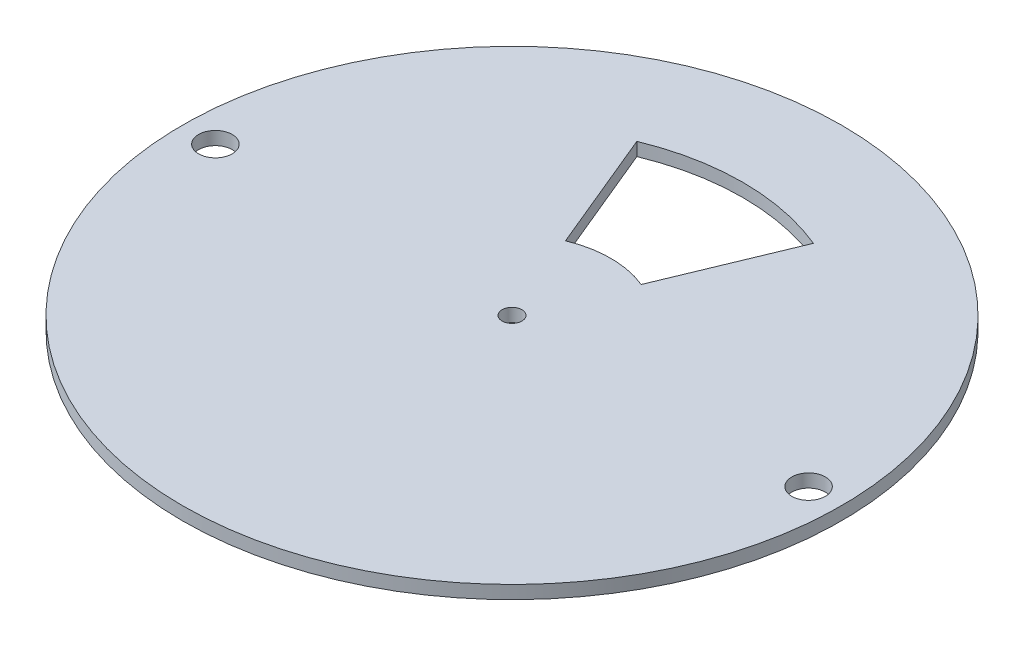
ISO-10303-21;
HEADER;
FILE_DESCRIPTION(('STEP AP214'),'2;1');
FILE_NAME('part.step','',(''),(''),'','','');
FILE_SCHEMA(('AUTOMOTIVE_DESIGN { 1 0 10303 214 1 1 1 1 }'));
ENDSEC;
DATA;
#1=APPLICATION_CONTEXT('core data for automotive mechanical design processes');
#2=APPLICATION_PROTOCOL_DEFINITION('international standard','automotive_design',2000,#1);
#3=PRODUCT_CONTEXT('',#1,'mechanical');
#4=PRODUCT('Part','Part','',(#3));
#5=PRODUCT_RELATED_PRODUCT_CATEGORY('part','',(#4));
#6=PRODUCT_DEFINITION_FORMATION('','',#4);
#7=PRODUCT_DEFINITION_CONTEXT('part definition',#1,'design');
#8=PRODUCT_DEFINITION('design','',#6,#7);
#9=PRODUCT_DEFINITION_SHAPE('','',#8);
#10=(LENGTH_UNIT() NAMED_UNIT(*) SI_UNIT(.MILLI.,.METRE.));
#11=(NAMED_UNIT(*) PLANE_ANGLE_UNIT() SI_UNIT($,.RADIAN.));
#12=(NAMED_UNIT(*) SI_UNIT($,.STERADIAN.) SOLID_ANGLE_UNIT());
#13=UNCERTAINTY_MEASURE_WITH_UNIT(LENGTH_MEASURE(1.E-05),#10,'distance_accuracy_value','');
#14=(GEOMETRIC_REPRESENTATION_CONTEXT(3) GLOBAL_UNCERTAINTY_ASSIGNED_CONTEXT((#13)) GLOBAL_UNIT_ASSIGNED_CONTEXT((#10,
#11,#12)) REPRESENTATION_CONTEXT('',''));
#15=CARTESIAN_POINT('',(0.,0.,0.));
#16=DIRECTION('',(0.,0.,1.));
#17=DIRECTION('',(1.,0.,0.));
#18=AXIS2_PLACEMENT_3D('',#15,#16,#17);
#19=CARTESIAN_POINT('',(0.,2.,0.));
#20=DIRECTION('',(0.,1.,0.));
#21=DIRECTION('',(0.,0.,1.));
#22=AXIS2_PLACEMENT_3D('',#19,#20,#21);
#23=PLANE('',#22);
#24=CARTESIAN_POINT('',(0.,2.,0.));
#25=DIRECTION('',(0.,1.,0.));
#26=DIRECTION('',(0.,0.,1.));
#27=AXIS2_PLACEMENT_3D('',#24,#25,#26);
#28=CIRCLE('',#27,1.5);
#29=CARTESIAN_POINT('',(0.,2.,1.5));
#30=VERTEX_POINT('',#29);
#31=EDGE_CURVE('E132',#30,#30,#28,.T.);
#32=ORIENTED_EDGE('',*,*,#31,.F.);
#33=EDGE_LOOP('',(#32));
#34=FACE_BOUND('',#33,.T.);
#35=CARTESIAN_POINT('',(-45.,2.,0.));
#36=DIRECTION('',(0.,1.,0.));
#37=DIRECTION('',(0.,0.,-1.));
#38=AXIS2_PLACEMENT_3D('',#35,#36,#37);
#39=CIRCLE('',#38,2.54999999999999);
#40=CARTESIAN_POINT('',(-45.,2.,-2.54999999999999));
#41=VERTEX_POINT('',#40);
#42=EDGE_CURVE('E126',#41,#41,#39,.T.);
#43=ORIENTED_EDGE('',*,*,#42,.F.);
#44=EDGE_LOOP('',(#43));
#45=FACE_BOUND('',#44,.T.);
#46=CARTESIAN_POINT('',(45.,2.,0.));
#47=DIRECTION('',(0.,1.,0.));
#48=DIRECTION('',(0.,0.,1.));
#49=AXIS2_PLACEMENT_3D('',#46,#47,#48);
#50=CIRCLE('',#49,2.54999999999999);
#51=CARTESIAN_POINT('',(45.,2.,2.54999999999999));
#52=VERTEX_POINT('',#51);
#53=EDGE_CURVE('E120',#52,#52,#50,.T.);
#54=ORIENTED_EDGE('',*,*,#53,.F.);
#55=EDGE_LOOP('',(#54));
#56=FACE_BOUND('',#55,.T.);
#57=CARTESIAN_POINT('',(0.,2.,0.));
#58=DIRECTION('',(0.,1.,0.));
#59=DIRECTION('',(0.,0.,1.));
#60=AXIS2_PLACEMENT_3D('',#57,#58,#59);
#61=CIRCLE('',#60,50.);
#62=CARTESIAN_POINT('',(0.,2.,50.));
#63=VERTEX_POINT('',#62);
#64=EDGE_CURVE('E11',#63,#63,#61,.T.);
#65=ORIENTED_EDGE('',*,*,#64,.T.);
#66=EDGE_LOOP('',(#65));
#67=FACE_BOUND('',#66,.T.);
#68=DIRECTION('',(-0.382683432365087,0.,-0.923879532511288));
#69=VECTOR('',#68,1.);
#70=CARTESIAN_POINT('',(-5.7402514854763,2.,-13.8581929876693));
#71=LINE('',#70,#69);
#72=CARTESIAN_POINT('',(-5.74025148547631,2.,-13.8581929876693));
#73=VERTEX_POINT('',#72);
#74=CARTESIAN_POINT('',(-13.3939201327781,2.,-32.3357836378951));
#75=VERTEX_POINT('',#74);
#76=EDGE_CURVE('E89',#73,#75,#71,.T.);
#77=ORIENTED_EDGE('',*,*,#76,.T.);
#78=CARTESIAN_POINT('',(0.,2.,0.));
#79=DIRECTION('',(0.,-1.,0.));
#80=DIRECTION('',(0.,0.,-1.));
#81=AXIS2_PLACEMENT_3D('',#78,#79,#80);
#82=CIRCLE('',#81,35.);
#83=CARTESIAN_POINT('',(13.3939201327781,2.,-32.3357836378951));
#84=VERTEX_POINT('',#83);
#85=EDGE_CURVE('E52',#75,#84,#82,.T.);
#86=ORIENTED_EDGE('',*,*,#85,.T.);
#87=DIRECTION('',(-0.382683432365087,0.,0.923879532511288));
#88=VECTOR('',#87,1.);
#89=CARTESIAN_POINT('',(13.3939201327781,2.,-32.3357836378951));
#90=LINE('',#89,#88);
#91=CARTESIAN_POINT('',(5.7402514854763,2.,-13.8581929876693));
#92=VERTEX_POINT('',#91);
#93=EDGE_CURVE('E95',#84,#92,#90,.T.);
#94=ORIENTED_EDGE('',*,*,#93,.T.);
#95=CARTESIAN_POINT('',(0.,2.,0.));
#96=DIRECTION('',(0.,-1.,0.));
#97=DIRECTION('',(0.,0.,-1.));
#98=AXIS2_PLACEMENT_3D('',#95,#96,#97);
#99=CIRCLE('',#98,15.);
#100=EDGE_CURVE('E103',#73,#92,#99,.T.);
#101=ORIENTED_EDGE('',*,*,#100,.F.);
#102=EDGE_LOOP('',(#77,#86,#94,#101));
#103=FACE_BOUND('',#102,.T.);
#104=ADVANCED_FACE('F37',(#34,#45,#56,#67,#103),#23,.T.);
#105=CARTESIAN_POINT('',(0.,0.,0.));
#106=DIRECTION('',(0.,1.,0.));
#107=DIRECTION('',(0.,0.,1.));
#108=AXIS2_PLACEMENT_3D('',#105,#106,#107);
#109=PLANE('',#108);
#110=CARTESIAN_POINT('',(0.,0.,0.));
#111=DIRECTION('',(0.,1.,0.));
#112=DIRECTION('',(0.,0.,1.));
#113=AXIS2_PLACEMENT_3D('',#110,#111,#112);
#114=CIRCLE('',#113,1.5);
#115=CARTESIAN_POINT('',(0.,0.,1.5));
#116=VERTEX_POINT('',#115);
#117=EDGE_CURVE('E129',#116,#116,#114,.T.);
#118=ORIENTED_EDGE('',*,*,#117,.T.);
#119=EDGE_LOOP('',(#118));
#120=FACE_BOUND('',#119,.T.);
#121=CARTESIAN_POINT('',(-45.,0.,0.));
#122=DIRECTION('',(0.,1.,0.));
#123=DIRECTION('',(0.,0.,-1.));
#124=AXIS2_PLACEMENT_3D('',#121,#122,#123);
#125=CIRCLE('',#124,2.54999999999999);
#126=CARTESIAN_POINT('',(-45.,0.,-2.54999999999999));
#127=VERTEX_POINT('',#126);
#128=EDGE_CURVE('E124',#127,#127,#125,.T.);
#129=ORIENTED_EDGE('',*,*,#128,.T.);
#130=EDGE_LOOP('',(#129));
#131=FACE_BOUND('',#130,.T.);
#132=CARTESIAN_POINT('',(45.,0.,0.));
#133=DIRECTION('',(0.,1.,0.));
#134=DIRECTION('',(0.,0.,1.));
#135=AXIS2_PLACEMENT_3D('',#132,#133,#134);
#136=CIRCLE('',#135,2.54999999999999);
#137=CARTESIAN_POINT('',(45.,0.,2.54999999999999));
#138=VERTEX_POINT('',#137);
#139=EDGE_CURVE('E118',#138,#138,#136,.T.);
#140=ORIENTED_EDGE('',*,*,#139,.T.);
#141=EDGE_LOOP('',(#140));
#142=FACE_BOUND('',#141,.T.);
#143=CARTESIAN_POINT('',(0.,0.,0.));
#144=DIRECTION('',(0.,1.,0.));
#145=DIRECTION('',(0.,0.,1.));
#146=AXIS2_PLACEMENT_3D('',#143,#144,#145);
#147=CIRCLE('',#146,50.);
#148=CARTESIAN_POINT('',(0.,0.,50.));
#149=VERTEX_POINT('',#148);
#150=EDGE_CURVE('E41',#149,#149,#147,.T.);
#151=ORIENTED_EDGE('',*,*,#150,.F.);
#152=EDGE_LOOP('',(#151));
#153=FACE_BOUND('',#152,.T.);
#154=CARTESIAN_POINT('',(0.,0.,0.));
#155=DIRECTION('',(0.,1.,0.));
#156=DIRECTION('',(0.,0.,1.));
#157=AXIS2_PLACEMENT_3D('',#154,#155,#156);
#158=CIRCLE('',#157,35.);
#159=CARTESIAN_POINT('',(13.3939201327781,0.,-32.3357836378951));
#160=VERTEX_POINT('',#159);
#161=CARTESIAN_POINT('',(-13.3939201327781,0.,-32.3357836378951));
#162=VERTEX_POINT('',#161);
#163=EDGE_CURVE('E87',#160,#162,#158,.T.);
#164=ORIENTED_EDGE('',*,*,#163,.T.);
#165=DIRECTION('',(0.382683432365087,0.,0.923879532511288));
#166=VECTOR('',#165,1.);
#167=CARTESIAN_POINT('',(-5.7402514854763,0.,-13.8581929876693));
#168=LINE('',#167,#166);
#169=CARTESIAN_POINT('',(-5.74025148547631,0.,-13.8581929876693));
#170=VERTEX_POINT('',#169);
#171=EDGE_CURVE('E77',#162,#170,#168,.T.);
#172=ORIENTED_EDGE('',*,*,#171,.T.);
#173=CARTESIAN_POINT('',(0.,0.,0.));
#174=DIRECTION('',(0.,1.,0.));
#175=DIRECTION('',(0.,0.,1.));
#176=AXIS2_PLACEMENT_3D('',#173,#174,#175);
#177=CIRCLE('',#176,15.);
#178=CARTESIAN_POINT('',(5.7402514854763,0.,-13.8581929876693));
#179=VERTEX_POINT('',#178);
#180=EDGE_CURVE('E97',#179,#170,#177,.T.);
#181=ORIENTED_EDGE('',*,*,#180,.F.);
#182=DIRECTION('',(0.382683432365087,0.,-0.923879532511288));
#183=VECTOR('',#182,1.);
#184=CARTESIAN_POINT('',(13.3939201327781,0.,-32.3357836378951));
#185=LINE('',#184,#183);
#186=EDGE_CURVE('E93',#179,#160,#185,.T.);
#187=ORIENTED_EDGE('',*,*,#186,.T.);
#188=EDGE_LOOP('',(#164,#172,#181,#187));
#189=FACE_BOUND('',#188,.T.);
#190=ADVANCED_FACE('F92',(#120,#131,#142,#153,#189),#109,.F.);
#191=CARTESIAN_POINT('',(0.,2.,0.));
#192=DIRECTION('',(0.,-1.,0.));
#193=DIRECTION('',(0.,0.,-1.));
#194=AXIS2_PLACEMENT_3D('',#191,#192,#193);
#195=CYLINDRICAL_SURFACE('',#194,50.);
#196=ORIENTED_EDGE('',*,*,#64,.F.);
#197=EDGE_LOOP('',(#196));
#198=FACE_BOUND('',#197,.T.);
#199=ORIENTED_EDGE('',*,*,#150,.T.);
#200=EDGE_LOOP('',(#199));
#201=FACE_BOUND('',#200,.T.);
#202=ADVANCED_FACE('F39',(#198,#201),#195,.T.);
#203=CARTESIAN_POINT('',(0.,-0.00100000000000013,0.));
#204=DIRECTION('',(0.,1.,0.));
#205=DIRECTION('',(0.,0.,1.));
#206=AXIS2_PLACEMENT_3D('',#203,#204,#205);
#207=CYLINDRICAL_SURFACE('',#206,35.);
#208=DIRECTION('',(0.,1.,0.));
#209=VECTOR('',#208,1.);
#210=CARTESIAN_POINT('',(13.3939201327781,-0.00100000000000013,-32.3357836378951));
#211=LINE('',#210,#209);
#212=EDGE_CURVE('E84',#160,#84,#211,.T.);
#213=ORIENTED_EDGE('',*,*,#212,.T.);
#214=ORIENTED_EDGE('',*,*,#85,.F.);
#215=DIRECTION('',(0.,1.,0.));
#216=VECTOR('',#215,1.);
#217=CARTESIAN_POINT('',(-13.3939201327781,-0.00100000000000013,-32.3357836378951));
#218=LINE('',#217,#216);
#219=EDGE_CURVE('E79',#162,#75,#218,.T.);
#220=ORIENTED_EDGE('',*,*,#219,.F.);
#221=ORIENTED_EDGE('',*,*,#163,.F.);
#222=EDGE_LOOP('',(#213,#214,#220,#221));
#223=FACE_BOUND('',#222,.T.);
#224=ADVANCED_FACE('F86',(#223),#207,.F.);
#225=CARTESIAN_POINT('',(13.3939201327781,-0.00100000000000013,-32.3357836378951));
#226=DIRECTION('',(-0.923879532511288,0.,-0.382683432365087));
#227=DIRECTION('',(-0.382683432365087,0.,0.923879532511288));
#228=AXIS2_PLACEMENT_3D('',#225,#226,#227);
#229=PLANE('',#228);
#230=DIRECTION('',(0.,1.,0.));
#231=VECTOR('',#230,1.);
#232=CARTESIAN_POINT('',(5.7402514854763,-0.00100000000000013,-13.8581929876693));
#233=LINE('',#232,#231);
#234=EDGE_CURVE('E108',#179,#92,#233,.T.);
#235=ORIENTED_EDGE('',*,*,#234,.T.);
#236=ORIENTED_EDGE('',*,*,#93,.F.);
#237=ORIENTED_EDGE('',*,*,#212,.F.);
#238=ORIENTED_EDGE('',*,*,#186,.F.);
#239=EDGE_LOOP('',(#235,#236,#237,#238));
#240=FACE_BOUND('',#239,.T.);
#241=ADVANCED_FACE('F112',(#240),#229,.T.);
#242=CARTESIAN_POINT('',(0.,-0.00100000000000013,0.));
#243=DIRECTION('',(0.,1.,0.));
#244=DIRECTION('',(0.,0.,1.));
#245=AXIS2_PLACEMENT_3D('',#242,#243,#244);
#246=CYLINDRICAL_SURFACE('',#245,15.);
#247=ORIENTED_EDGE('',*,*,#180,.T.);
#248=DIRECTION('',(0.,1.,0.));
#249=VECTOR('',#248,1.);
#250=CARTESIAN_POINT('',(-5.74025148547631,-0.00100000000000013,-13.8581929876693));
#251=LINE('',#250,#249);
#252=EDGE_CURVE('E60',#170,#73,#251,.T.);
#253=ORIENTED_EDGE('',*,*,#252,.T.);
#254=ORIENTED_EDGE('',*,*,#100,.T.);
#255=ORIENTED_EDGE('',*,*,#234,.F.);
#256=EDGE_LOOP('',(#247,#253,#254,#255));
#257=FACE_BOUND('',#256,.T.);
#258=ADVANCED_FACE('F117',(#257),#246,.T.);
#259=CARTESIAN_POINT('',(-5.7402514854763,-0.00100000000000013,-13.8581929876693));
#260=DIRECTION('',(0.923879532511288,0.,-0.382683432365087));
#261=DIRECTION('',(-0.382683432365087,0.,-0.923879532511288));
#262=AXIS2_PLACEMENT_3D('',#259,#260,#261);
#263=PLANE('',#262);
#264=ORIENTED_EDGE('',*,*,#219,.T.);
#265=ORIENTED_EDGE('',*,*,#76,.F.);
#266=ORIENTED_EDGE('',*,*,#252,.F.);
#267=ORIENTED_EDGE('',*,*,#171,.F.);
#268=EDGE_LOOP('',(#264,#265,#266,#267));
#269=FACE_BOUND('',#268,.T.);
#270=ADVANCED_FACE('F78',(#269),#263,.T.);
#271=CARTESIAN_POINT('',(45.,0.,0.));
#272=DIRECTION('',(0.,1.,0.));
#273=DIRECTION('',(0.,0.,1.));
#274=AXIS2_PLACEMENT_3D('',#271,#272,#273);
#275=CYLINDRICAL_SURFACE('',#274,2.54999999999999);
#276=ORIENTED_EDGE('',*,*,#139,.F.);
#277=EDGE_LOOP('',(#276));
#278=FACE_BOUND('',#277,.T.);
#279=ORIENTED_EDGE('',*,*,#53,.T.);
#280=EDGE_LOOP('',(#279));
#281=FACE_BOUND('',#280,.T.);
#282=ADVANCED_FACE('F173',(#278,#281),#275,.F.);
#283=CARTESIAN_POINT('',(-45.,0.,0.));
#284=DIRECTION('',(0.,1.,0.));
#285=DIRECTION('',(0.,0.,1.));
#286=AXIS2_PLACEMENT_3D('',#283,#284,#285);
#287=CYLINDRICAL_SURFACE('',#286,2.54999999999999);
#288=ORIENTED_EDGE('',*,*,#128,.F.);
#289=EDGE_LOOP('',(#288));
#290=FACE_BOUND('',#289,.T.);
#291=ORIENTED_EDGE('',*,*,#42,.T.);
#292=EDGE_LOOP('',(#291));
#293=FACE_BOUND('',#292,.T.);
#294=ADVANCED_FACE('F143',(#290,#293),#287,.F.);
#295=CARTESIAN_POINT('',(0.,0.,0.));
#296=DIRECTION('',(0.,1.,0.));
#297=DIRECTION('',(0.,0.,1.));
#298=AXIS2_PLACEMENT_3D('',#295,#296,#297);
#299=CYLINDRICAL_SURFACE('',#298,1.5);
#300=ORIENTED_EDGE('',*,*,#117,.F.);
#301=EDGE_LOOP('',(#300));
#302=FACE_BOUND('',#301,.T.);
#303=ORIENTED_EDGE('',*,*,#31,.T.);
#304=EDGE_LOOP('',(#303));
#305=FACE_BOUND('',#304,.T.);
#306=ADVANCED_FACE('F140',(#302,#305),#299,.F.);
#307=CLOSED_SHELL('',(#104,#190,#202,#224,#241,#258,#270,#282,#294,#306));
#308=MANIFOLD_SOLID_BREP('B2',#307);
#309=ADVANCED_BREP_SHAPE_REPRESENTATION('',(#18,#308),#14);
#310=SHAPE_DEFINITION_REPRESENTATION(#9,#309);
ENDSEC;
END-ISO-10303-21;
